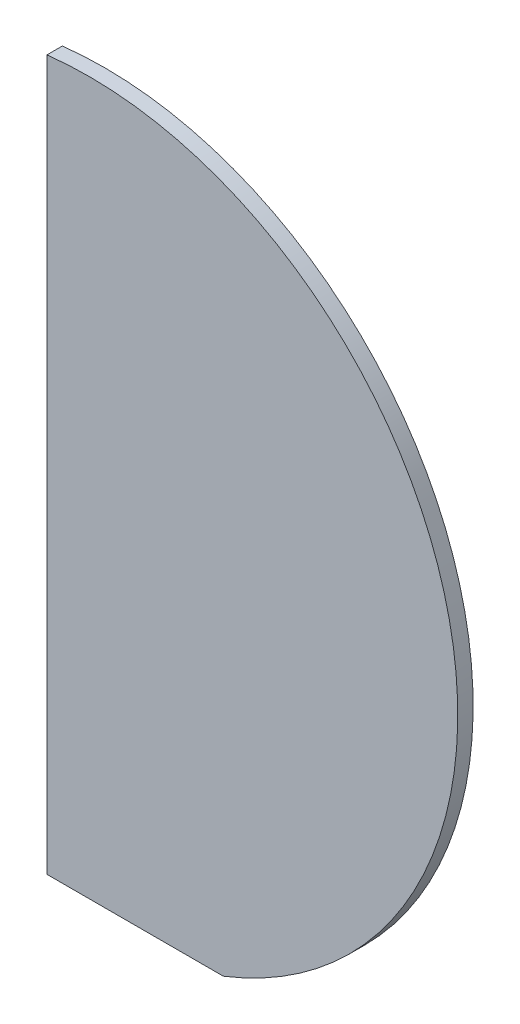
ISO-10303-21;
HEADER;
FILE_DESCRIPTION(('STEP AP214'),'2;1');
FILE_NAME('part.step','',(''),(''),'','','');
FILE_SCHEMA(('AUTOMOTIVE_DESIGN { 1 0 10303 214 1 1 1 1 }'));
ENDSEC;
DATA;
#1=APPLICATION_CONTEXT('core data for automotive mechanical design processes');
#2=APPLICATION_PROTOCOL_DEFINITION('international standard','automotive_design',2000,#1);
#3=PRODUCT_CONTEXT('',#1,'mechanical');
#4=PRODUCT('Part','Part','',(#3));
#5=PRODUCT_RELATED_PRODUCT_CATEGORY('part','',(#4));
#6=PRODUCT_DEFINITION_FORMATION('','',#4);
#7=PRODUCT_DEFINITION_CONTEXT('part definition',#1,'design');
#8=PRODUCT_DEFINITION('design','',#6,#7);
#9=PRODUCT_DEFINITION_SHAPE('','',#8);
#10=(LENGTH_UNIT() NAMED_UNIT(*) SI_UNIT(.MILLI.,.METRE.));
#11=(NAMED_UNIT(*) PLANE_ANGLE_UNIT() SI_UNIT($,.RADIAN.));
#12=(NAMED_UNIT(*) SI_UNIT($,.STERADIAN.) SOLID_ANGLE_UNIT());
#13=UNCERTAINTY_MEASURE_WITH_UNIT(LENGTH_MEASURE(1.E-05),#10,'distance_accuracy_value','');
#14=(GEOMETRIC_REPRESENTATION_CONTEXT(3) GLOBAL_UNCERTAINTY_ASSIGNED_CONTEXT((#13)) GLOBAL_UNIT_ASSIGNED_CONTEXT((#10,
#11,#12)) REPRESENTATION_CONTEXT('',''));
#15=CARTESIAN_POINT('',(0.,0.,0.));
#16=DIRECTION('',(0.,0.,1.));
#17=DIRECTION('',(1.,0.,0.));
#18=AXIS2_PLACEMENT_3D('',#15,#16,#17);
#19=CARTESIAN_POINT('',(0.,0.,75.));
#20=DIRECTION('',(0.,0.,-1.));
#21=DIRECTION('',(-1.,0.,0.));
#22=AXIS2_PLACEMENT_3D('',#19,#20,#21);
#23=CYLINDRICAL_SURFACE('',#22,240.);
#24=CARTESIAN_POINT('',(0.,0.,65.));
#25=DIRECTION('',(0.,0.,-1.));
#26=DIRECTION('',(-1.,0.,0.));
#27=AXIS2_PLACEMENT_3D('',#24,#25,#26);
#28=CIRCLE('',#27,240.);
#29=CARTESIAN_POINT('',(-27.4110339249947,238.429518346959,65.));
#30=VERTEX_POINT('',#29);
#31=CARTESIAN_POINT('',(87.3846834013827,-223.526099386269,65.));
#32=VERTEX_POINT('',#31);
#33=EDGE_CURVE('E12',#30,#32,#28,.T.);
#34=ORIENTED_EDGE('',*,*,#33,.F.);
#35=DIRECTION('',(0.,0.,-1.));
#36=VECTOR('',#35,1.);
#37=CARTESIAN_POINT('',(-27.4110339249947,238.429518346959,75.));
#38=LINE('',#37,#36);
#39=CARTESIAN_POINT('',(-27.4110339249947,238.429518346959,75.));
#40=VERTEX_POINT('',#39);
#41=EDGE_CURVE('E73',#40,#30,#38,.T.);
#42=ORIENTED_EDGE('',*,*,#41,.F.);
#43=CARTESIAN_POINT('',(0.,0.,75.));
#44=DIRECTION('',(0.,0.,1.));
#45=DIRECTION('',(1.,0.,0.));
#46=AXIS2_PLACEMENT_3D('',#43,#44,#45);
#47=CIRCLE('',#46,240.);
#48=CARTESIAN_POINT('',(87.3846834013827,-223.526099386269,75.));
#49=VERTEX_POINT('',#48);
#50=EDGE_CURVE('E44',#49,#40,#47,.T.);
#51=ORIENTED_EDGE('',*,*,#50,.F.);
#52=DIRECTION('',(0.,0.,-1.));
#53=VECTOR('',#52,1.);
#54=CARTESIAN_POINT('',(87.3846834013827,-223.526099386269,75.));
#55=LINE('',#54,#53);
#56=EDGE_CURVE('E82',#49,#32,#55,.T.);
#57=ORIENTED_EDGE('',*,*,#56,.T.);
#58=EDGE_LOOP('',(#34,#42,#51,#57));
#59=FACE_BOUND('',#58,.T.);
#60=ADVANCED_FACE('F36',(#59),#23,.T.);
#61=CARTESIAN_POINT('',(0.,-223.526099386269,75.));
#62=DIRECTION('',(0.,-1.,0.));
#63=DIRECTION('',(0.,0.,-1.));
#64=AXIS2_PLACEMENT_3D('',#61,#62,#63);
#65=PLANE('',#64);
#66=DIRECTION('',(1.,0.,0.));
#67=VECTOR('',#66,1.);
#68=CARTESIAN_POINT('',(0.,-223.526099386269,65.));
#69=LINE('',#68,#67);
#70=CARTESIAN_POINT('',(-27.4110339249947,-223.526099386269,65.));
#71=VERTEX_POINT('',#70);
#72=EDGE_CURVE('E51',#71,#32,#69,.T.);
#73=ORIENTED_EDGE('',*,*,#72,.T.);
#74=ORIENTED_EDGE('',*,*,#56,.F.);
#75=DIRECTION('',(-1.,0.,0.));
#76=VECTOR('',#75,1.);
#77=CARTESIAN_POINT('',(0.,-223.526099386269,75.));
#78=LINE('',#77,#76);
#79=CARTESIAN_POINT('',(-27.4110339249947,-223.526099386269,75.));
#80=VERTEX_POINT('',#79);
#81=EDGE_CURVE('E78',#49,#80,#78,.T.);
#82=ORIENTED_EDGE('',*,*,#81,.T.);
#83=DIRECTION('',(0.,0.,-1.));
#84=VECTOR('',#83,1.);
#85=CARTESIAN_POINT('',(-27.4110339249947,-223.526099386269,75.));
#86=LINE('',#85,#84);
#87=EDGE_CURVE('E70',#80,#71,#86,.T.);
#88=ORIENTED_EDGE('',*,*,#87,.T.);
#89=EDGE_LOOP('',(#73,#74,#82,#88));
#90=FACE_BOUND('',#89,.T.);
#91=ADVANCED_FACE('F76',(#90),#65,.T.);
#92=CARTESIAN_POINT('',(-27.4110339249947,0.,75.));
#93=DIRECTION('',(-1.,0.,0.));
#94=DIRECTION('',(0.,0.,1.));
#95=AXIS2_PLACEMENT_3D('',#92,#93,#94);
#96=PLANE('',#95);
#97=ORIENTED_EDGE('',*,*,#41,.T.);
#98=DIRECTION('',(0.,-1.,0.));
#99=VECTOR('',#98,1.);
#100=CARTESIAN_POINT('',(-27.4110339249947,0.,65.));
#101=LINE('',#100,#99);
#102=EDGE_CURVE('E56',#30,#71,#101,.T.);
#103=ORIENTED_EDGE('',*,*,#102,.T.);
#104=ORIENTED_EDGE('',*,*,#87,.F.);
#105=DIRECTION('',(0.,1.,0.));
#106=VECTOR('',#105,1.);
#107=CARTESIAN_POINT('',(-27.4110339249947,0.,75.));
#108=LINE('',#107,#106);
#109=EDGE_CURVE('E74',#80,#40,#108,.T.);
#110=ORIENTED_EDGE('',*,*,#109,.T.);
#111=EDGE_LOOP('',(#97,#103,#104,#110));
#112=FACE_BOUND('',#111,.T.);
#113=ADVANCED_FACE('F38',(#112),#96,.T.);
#114=CARTESIAN_POINT('',(0.,0.,75.));
#115=DIRECTION('',(0.,0.,1.));
#116=DIRECTION('',(1.,0.,0.));
#117=AXIS2_PLACEMENT_3D('',#114,#115,#116);
#118=PLANE('',#117);
#119=ORIENTED_EDGE('',*,*,#109,.F.);
#120=ORIENTED_EDGE('',*,*,#81,.F.);
#121=ORIENTED_EDGE('',*,*,#50,.T.);
#122=EDGE_LOOP('',(#119,#120,#121));
#123=FACE_BOUND('',#122,.T.);
#124=ADVANCED_FACE('F92',(#123),#118,.T.);
#125=CARTESIAN_POINT('',(0.,0.,65.));
#126=DIRECTION('',(0.,0.,1.));
#127=DIRECTION('',(1.,0.,0.));
#128=AXIS2_PLACEMENT_3D('',#125,#126,#127);
#129=PLANE('',#128);
#130=ORIENTED_EDGE('',*,*,#72,.F.);
#131=ORIENTED_EDGE('',*,*,#102,.F.);
#132=ORIENTED_EDGE('',*,*,#33,.T.);
#133=EDGE_LOOP('',(#130,#131,#132));
#134=FACE_BOUND('',#133,.T.);
#135=ADVANCED_FACE('F80',(#134),#129,.F.);
#136=CLOSED_SHELL('',(#60,#91,#113,#124,#135));
#137=MANIFOLD_SOLID_BREP('B2',#136);
#138=ADVANCED_BREP_SHAPE_REPRESENTATION('',(#18,#137),#14);
#139=SHAPE_DEFINITION_REPRESENTATION(#9,#138);
ENDSEC;
END-ISO-10303-21;
